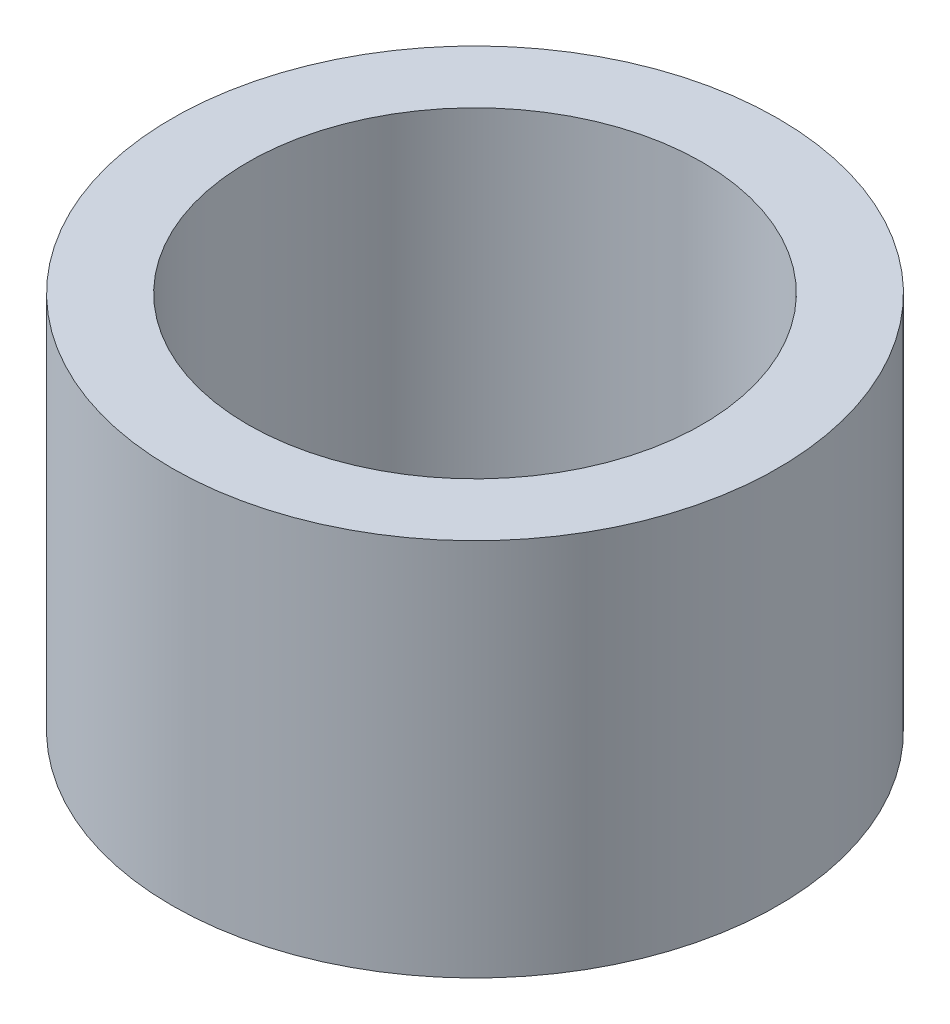
ISO-10303-21;
HEADER;
FILE_DESCRIPTION(('STEP AP214'),'2;1');
FILE_NAME('part.step','',(''),(''),'','','');
FILE_SCHEMA(('AUTOMOTIVE_DESIGN { 1 0 10303 214 1 1 1 1 }'));
ENDSEC;
DATA;
#1=APPLICATION_CONTEXT('core data for automotive mechanical design processes');
#2=APPLICATION_PROTOCOL_DEFINITION('international standard','automotive_design',2000,#1);
#3=PRODUCT_CONTEXT('',#1,'mechanical');
#4=PRODUCT('Part','Part','',(#3));
#5=PRODUCT_RELATED_PRODUCT_CATEGORY('part','',(#4));
#6=PRODUCT_DEFINITION_FORMATION('','',#4);
#7=PRODUCT_DEFINITION_CONTEXT('part definition',#1,'design');
#8=PRODUCT_DEFINITION('design','',#6,#7);
#9=PRODUCT_DEFINITION_SHAPE('','',#8);
#10=(LENGTH_UNIT() NAMED_UNIT(*) SI_UNIT(.MILLI.,.METRE.));
#11=(NAMED_UNIT(*) PLANE_ANGLE_UNIT() SI_UNIT($,.RADIAN.));
#12=(NAMED_UNIT(*) SI_UNIT($,.STERADIAN.) SOLID_ANGLE_UNIT());
#13=UNCERTAINTY_MEASURE_WITH_UNIT(LENGTH_MEASURE(1.E-05),#10,'distance_accuracy_value','');
#14=(GEOMETRIC_REPRESENTATION_CONTEXT(3) GLOBAL_UNCERTAINTY_ASSIGNED_CONTEXT((#13)) GLOBAL_UNIT_ASSIGNED_CONTEXT((#10,
#11,#12)) REPRESENTATION_CONTEXT('',''));
#15=CARTESIAN_POINT('',(0.,0.,0.));
#16=DIRECTION('',(0.,0.,1.));
#17=DIRECTION('',(1.,0.,0.));
#18=AXIS2_PLACEMENT_3D('',#15,#16,#17);
#19=CARTESIAN_POINT('',(0.,5.,0.));
#20=DIRECTION('',(0.,1.,0.));
#21=DIRECTION('',(0.,0.,1.));
#22=AXIS2_PLACEMENT_3D('',#19,#20,#21);
#23=PLANE('',#22);
#24=CARTESIAN_POINT('',(0.,5.,0.));
#25=DIRECTION('',(0.,1.,0.));
#26=DIRECTION('',(0.,0.,1.));
#27=AXIS2_PLACEMENT_3D('',#24,#25,#26);
#28=CIRCLE('',#27,4.);
#29=CARTESIAN_POINT('',(0.,5.,4.));
#30=VERTEX_POINT('',#29);
#31=EDGE_CURVE('E10',#30,#30,#28,.T.);
#32=ORIENTED_EDGE('',*,*,#31,.T.);
#33=EDGE_LOOP('',(#32));
#34=FACE_BOUND('',#33,.T.);
#35=CARTESIAN_POINT('',(0.,5.,0.));
#36=DIRECTION('',(0.,1.,0.));
#37=DIRECTION('',(0.,0.,1.));
#38=AXIS2_PLACEMENT_3D('',#35,#36,#37);
#39=CIRCLE('',#38,3.);
#40=CARTESIAN_POINT('',(0.,5.,3.));
#41=VERTEX_POINT('',#40);
#42=EDGE_CURVE('E45',#41,#41,#39,.T.);
#43=ORIENTED_EDGE('',*,*,#42,.F.);
#44=EDGE_LOOP('',(#43));
#45=FACE_BOUND('',#44,.T.);
#46=ADVANCED_FACE('F34',(#34,#45),#23,.T.);
#47=CARTESIAN_POINT('',(0.,0.,0.));
#48=DIRECTION('',(0.,1.,0.));
#49=DIRECTION('',(0.,0.,1.));
#50=AXIS2_PLACEMENT_3D('',#47,#48,#49);
#51=PLANE('',#50);
#52=CARTESIAN_POINT('',(0.,0.,0.));
#53=DIRECTION('',(0.,1.,0.));
#54=DIRECTION('',(0.,0.,1.));
#55=AXIS2_PLACEMENT_3D('',#52,#53,#54);
#56=CIRCLE('',#55,4.);
#57=CARTESIAN_POINT('',(0.,0.,4.));
#58=VERTEX_POINT('',#57);
#59=EDGE_CURVE('E38',#58,#58,#56,.T.);
#60=ORIENTED_EDGE('',*,*,#59,.F.);
#61=EDGE_LOOP('',(#60));
#62=FACE_BOUND('',#61,.T.);
#63=CARTESIAN_POINT('',(0.,0.,0.));
#64=DIRECTION('',(0.,1.,0.));
#65=DIRECTION('',(0.,0.,1.));
#66=AXIS2_PLACEMENT_3D('',#63,#64,#65);
#67=CIRCLE('',#66,3.);
#68=CARTESIAN_POINT('',(0.,0.,3.));
#69=VERTEX_POINT('',#68);
#70=EDGE_CURVE('E47',#69,#69,#67,.T.);
#71=ORIENTED_EDGE('',*,*,#70,.T.);
#72=EDGE_LOOP('',(#71));
#73=FACE_BOUND('',#72,.T.);
#74=ADVANCED_FACE('F57',(#62,#73),#51,.F.);
#75=CARTESIAN_POINT('',(0.,5.,0.));
#76=DIRECTION('',(0.,-1.,0.));
#77=DIRECTION('',(0.,0.,-1.));
#78=AXIS2_PLACEMENT_3D('',#75,#76,#77);
#79=CYLINDRICAL_SURFACE('',#78,4.);
#80=ORIENTED_EDGE('',*,*,#31,.F.);
#81=EDGE_LOOP('',(#80));
#82=FACE_BOUND('',#81,.T.);
#83=ORIENTED_EDGE('',*,*,#59,.T.);
#84=EDGE_LOOP('',(#83));
#85=FACE_BOUND('',#84,.T.);
#86=ADVANCED_FACE('F36',(#82,#85),#79,.T.);
#87=CARTESIAN_POINT('',(0.,5.,0.));
#88=DIRECTION('',(0.,-1.,0.));
#89=DIRECTION('',(0.,0.,-1.));
#90=AXIS2_PLACEMENT_3D('',#87,#88,#89);
#91=CYLINDRICAL_SURFACE('',#90,3.);
#92=ORIENTED_EDGE('',*,*,#42,.T.);
#93=EDGE_LOOP('',(#92));
#94=FACE_BOUND('',#93,.T.);
#95=ORIENTED_EDGE('',*,*,#70,.F.);
#96=EDGE_LOOP('',(#95));
#97=FACE_BOUND('',#96,.T.);
#98=ADVANCED_FACE('F53',(#94,#97),#91,.F.);
#99=CLOSED_SHELL('',(#46,#74,#86,#98));
#100=MANIFOLD_SOLID_BREP('B2',#99);
#101=ADVANCED_BREP_SHAPE_REPRESENTATION('',(#18,#100),#14);
#102=SHAPE_DEFINITION_REPRESENTATION(#9,#101);
ENDSEC;
END-ISO-10303-21;
